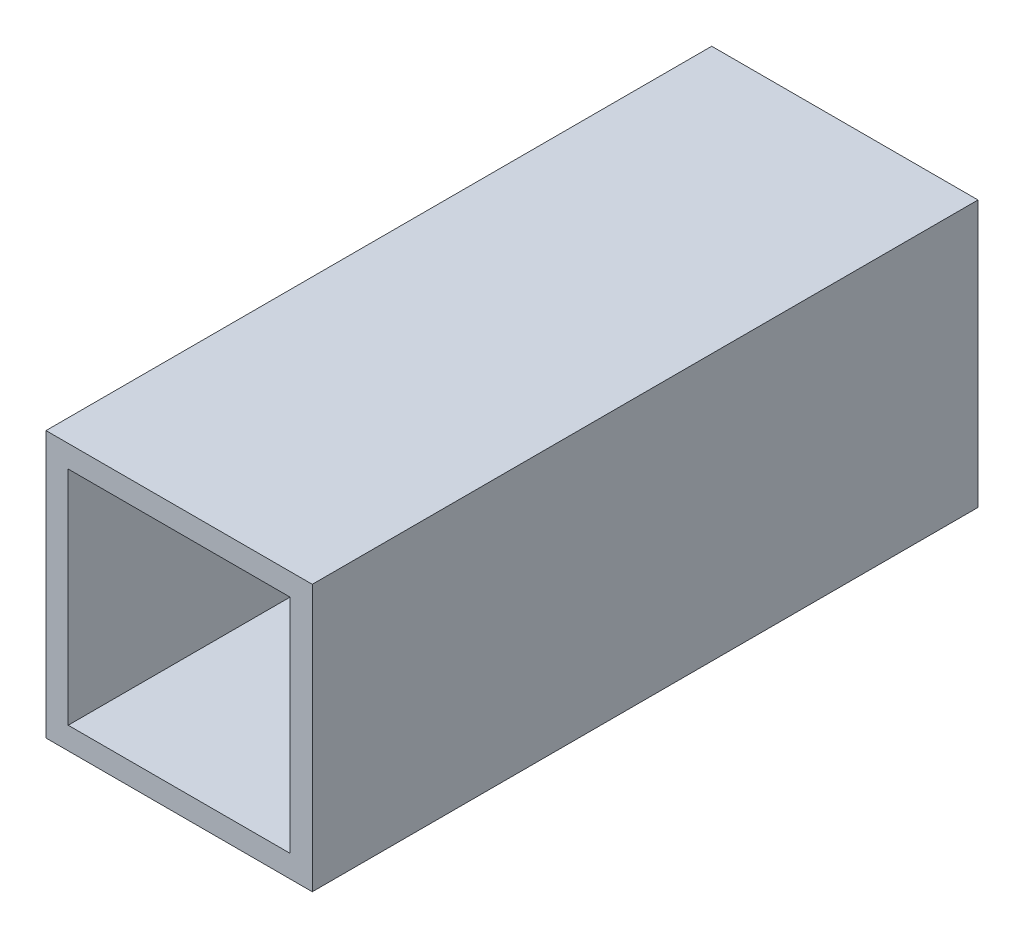
ISO-10303-21;
HEADER;
FILE_DESCRIPTION(('STEP AP214'),'2;1');
FILE_NAME('part.step','',(''),(''),'','','');
FILE_SCHEMA(('AUTOMOTIVE_DESIGN { 1 0 10303 214 1 1 1 1 }'));
ENDSEC;
DATA;
#1=APPLICATION_CONTEXT('core data for automotive mechanical design processes');
#2=APPLICATION_PROTOCOL_DEFINITION('international standard','automotive_design',2000,#1);
#3=PRODUCT_CONTEXT('',#1,'mechanical');
#4=PRODUCT('Part','Part','',(#3));
#5=PRODUCT_RELATED_PRODUCT_CATEGORY('part','',(#4));
#6=PRODUCT_DEFINITION_FORMATION('','',#4);
#7=PRODUCT_DEFINITION_CONTEXT('part definition',#1,'design');
#8=PRODUCT_DEFINITION('design','',#6,#7);
#9=PRODUCT_DEFINITION_SHAPE('','',#8);
#10=(LENGTH_UNIT() NAMED_UNIT(*) SI_UNIT(.MILLI.,.METRE.));
#11=(NAMED_UNIT(*) PLANE_ANGLE_UNIT() SI_UNIT($,.RADIAN.));
#12=(NAMED_UNIT(*) SI_UNIT($,.STERADIAN.) SOLID_ANGLE_UNIT());
#13=UNCERTAINTY_MEASURE_WITH_UNIT(LENGTH_MEASURE(1.E-05),#10,'distance_accuracy_value','');
#14=(GEOMETRIC_REPRESENTATION_CONTEXT(3) GLOBAL_UNCERTAINTY_ASSIGNED_CONTEXT((#13)) GLOBAL_UNIT_ASSIGNED_CONTEXT((#10,
#11,#12)) REPRESENTATION_CONTEXT('',''));
#15=CARTESIAN_POINT('',(0.,0.,0.));
#16=DIRECTION('',(0.,0.,1.));
#17=DIRECTION('',(1.,0.,0.));
#18=AXIS2_PLACEMENT_3D('',#15,#16,#17);
#19=CARTESIAN_POINT('',(0.,0.,60.));
#20=DIRECTION('',(0.,0.,1.));
#21=DIRECTION('',(1.,0.,0.));
#22=AXIS2_PLACEMENT_3D('',#19,#20,#21);
#23=PLANE('',#22);
#24=DIRECTION('',(0.,-1.,0.));
#25=VECTOR('',#24,1.);
#26=CARTESIAN_POINT('',(-12.,12.,60.));
#27=LINE('',#26,#25);
#28=CARTESIAN_POINT('',(-12.,12.,60.));
#29=VERTEX_POINT('',#28);
#30=CARTESIAN_POINT('',(-12.,-12.,60.));
#31=VERTEX_POINT('',#30);
#32=EDGE_CURVE('E136',#29,#31,#27,.T.);
#33=ORIENTED_EDGE('',*,*,#32,.T.);
#34=DIRECTION('',(1.,0.,0.));
#35=VECTOR('',#34,1.);
#36=CARTESIAN_POINT('',(-12.,-12.,60.));
#37=LINE('',#36,#35);
#38=CARTESIAN_POINT('',(12.,-12.,60.));
#39=VERTEX_POINT('',#38);
#40=EDGE_CURVE('E139',#31,#39,#37,.T.);
#41=ORIENTED_EDGE('',*,*,#40,.T.);
#42=DIRECTION('',(0.,1.,0.));
#43=VECTOR('',#42,1.);
#44=CARTESIAN_POINT('',(12.,12.,60.));
#45=LINE('',#44,#43);
#46=CARTESIAN_POINT('',(12.,12.,60.));
#47=VERTEX_POINT('',#46);
#48=EDGE_CURVE('E142',#39,#47,#45,.T.);
#49=ORIENTED_EDGE('',*,*,#48,.T.);
#50=DIRECTION('',(-1.,0.,0.));
#51=VECTOR('',#50,1.);
#52=CARTESIAN_POINT('',(-12.,12.,60.));
#53=LINE('',#52,#51);
#54=EDGE_CURVE('E144',#47,#29,#53,.T.);
#55=ORIENTED_EDGE('',*,*,#54,.T.);
#56=EDGE_LOOP('',(#33,#41,#49,#55));
#57=FACE_BOUND('',#56,.T.);
#58=DIRECTION('',(-1.,0.,0.));
#59=VECTOR('',#58,1.);
#60=CARTESIAN_POINT('',(-10.,10.,60.));
#61=LINE('',#60,#59);
#62=CARTESIAN_POINT('',(10.,10.,60.));
#63=VERTEX_POINT('',#62);
#64=CARTESIAN_POINT('',(-10.,10.,60.));
#65=VERTEX_POINT('',#64);
#66=EDGE_CURVE('E108',#63,#65,#61,.T.);
#67=ORIENTED_EDGE('',*,*,#66,.F.);
#68=DIRECTION('',(0.,1.,0.));
#69=VECTOR('',#68,1.);
#70=CARTESIAN_POINT('',(10.,10.,60.));
#71=LINE('',#70,#69);
#72=CARTESIAN_POINT('',(10.,-10.,60.));
#73=VERTEX_POINT('',#72);
#74=EDGE_CURVE('E100',#73,#63,#71,.T.);
#75=ORIENTED_EDGE('',*,*,#74,.F.);
#76=DIRECTION('',(1.,0.,0.));
#77=VECTOR('',#76,1.);
#78=CARTESIAN_POINT('',(-10.,-10.,60.));
#79=LINE('',#78,#77);
#80=CARTESIAN_POINT('',(-10.,-10.,60.));
#81=VERTEX_POINT('',#80);
#82=EDGE_CURVE('E122',#81,#73,#79,.T.);
#83=ORIENTED_EDGE('',*,*,#82,.F.);
#84=DIRECTION('',(0.,-1.,0.));
#85=VECTOR('',#84,1.);
#86=CARTESIAN_POINT('',(-10.,10.,60.));
#87=LINE('',#86,#85);
#88=EDGE_CURVE('E120',#65,#81,#87,.T.);
#89=ORIENTED_EDGE('',*,*,#88,.F.);
#90=EDGE_LOOP('',(#67,#75,#83,#89));
#91=FACE_BOUND('',#90,.T.);
#92=ADVANCED_FACE('F35',(#57,#91),#23,.T.);
#93=CARTESIAN_POINT('',(0.,0.,0.));
#94=DIRECTION('',(0.,0.,1.));
#95=DIRECTION('',(1.,0.,0.));
#96=AXIS2_PLACEMENT_3D('',#93,#94,#95);
#97=PLANE('',#96);
#98=DIRECTION('',(0.,-1.,0.));
#99=VECTOR('',#98,1.);
#100=CARTESIAN_POINT('',(-12.,12.,0.));
#101=LINE('',#100,#99);
#102=CARTESIAN_POINT('',(-12.,12.,0.));
#103=VERTEX_POINT('',#102);
#104=CARTESIAN_POINT('',(-12.,-12.,0.));
#105=VERTEX_POINT('',#104);
#106=EDGE_CURVE('E116',#103,#105,#101,.T.);
#107=ORIENTED_EDGE('',*,*,#106,.F.);
#108=DIRECTION('',(-1.,0.,0.));
#109=VECTOR('',#108,1.);
#110=CARTESIAN_POINT('',(-12.,12.,0.));
#111=LINE('',#110,#109);
#112=CARTESIAN_POINT('',(12.,12.,0.));
#113=VERTEX_POINT('',#112);
#114=EDGE_CURVE('E140',#113,#103,#111,.T.);
#115=ORIENTED_EDGE('',*,*,#114,.F.);
#116=DIRECTION('',(0.,1.,0.));
#117=VECTOR('',#116,1.);
#118=CARTESIAN_POINT('',(12.,12.,0.));
#119=LINE('',#118,#117);
#120=CARTESIAN_POINT('',(12.,-12.,0.));
#121=VERTEX_POINT('',#120);
#122=EDGE_CURVE('E151',#121,#113,#119,.T.);
#123=ORIENTED_EDGE('',*,*,#122,.F.);
#124=DIRECTION('',(1.,0.,0.));
#125=VECTOR('',#124,1.);
#126=CARTESIAN_POINT('',(-12.,-12.,0.));
#127=LINE('',#126,#125);
#128=EDGE_CURVE('E149',#105,#121,#127,.T.);
#129=ORIENTED_EDGE('',*,*,#128,.F.);
#130=EDGE_LOOP('',(#107,#115,#123,#129));
#131=FACE_BOUND('',#130,.T.);
#132=DIRECTION('',(0.,1.,0.));
#133=VECTOR('',#132,1.);
#134=CARTESIAN_POINT('',(10.,10.,0.));
#135=LINE('',#134,#133);
#136=CARTESIAN_POINT('',(10.,-10.,0.));
#137=VERTEX_POINT('',#136);
#138=CARTESIAN_POINT('',(10.,10.,0.));
#139=VERTEX_POINT('',#138);
#140=EDGE_CURVE('E58',#137,#139,#135,.T.);
#141=ORIENTED_EDGE('',*,*,#140,.T.);
#142=DIRECTION('',(-1.,0.,0.));
#143=VECTOR('',#142,1.);
#144=CARTESIAN_POINT('',(-10.,10.,0.));
#145=LINE('',#144,#143);
#146=CARTESIAN_POINT('',(-10.,10.,0.));
#147=VERTEX_POINT('',#146);
#148=EDGE_CURVE('E115',#139,#147,#145,.T.);
#149=ORIENTED_EDGE('',*,*,#148,.T.);
#150=DIRECTION('',(0.,-1.,0.));
#151=VECTOR('',#150,1.);
#152=CARTESIAN_POINT('',(-10.,10.,0.));
#153=LINE('',#152,#151);
#154=CARTESIAN_POINT('',(-10.,-10.,0.));
#155=VERTEX_POINT('',#154);
#156=EDGE_CURVE('E128',#147,#155,#153,.T.);
#157=ORIENTED_EDGE('',*,*,#156,.T.);
#158=DIRECTION('',(1.,0.,0.));
#159=VECTOR('',#158,1.);
#160=CARTESIAN_POINT('',(-10.,-10.,0.));
#161=LINE('',#160,#159);
#162=EDGE_CURVE('E109',#155,#137,#161,.T.);
#163=ORIENTED_EDGE('',*,*,#162,.T.);
#164=EDGE_LOOP('',(#141,#149,#157,#163));
#165=FACE_BOUND('',#164,.T.);
#166=ADVANCED_FACE('F169',(#131,#165),#97,.F.);
#167=CARTESIAN_POINT('',(-12.,12.,60.));
#168=DIRECTION('',(1.,0.,0.));
#169=DIRECTION('',(0.,1.,0.));
#170=AXIS2_PLACEMENT_3D('',#167,#168,#169);
#171=PLANE('',#170);
#172=ORIENTED_EDGE('',*,*,#106,.T.);
#173=DIRECTION('',(0.,0.,-1.));
#174=VECTOR('',#173,1.);
#175=CARTESIAN_POINT('',(-12.,-12.,60.));
#176=LINE('',#175,#174);
#177=EDGE_CURVE('E11',#31,#105,#176,.T.);
#178=ORIENTED_EDGE('',*,*,#177,.F.);
#179=ORIENTED_EDGE('',*,*,#32,.F.);
#180=DIRECTION('',(0.,0.,-1.));
#181=VECTOR('',#180,1.);
#182=CARTESIAN_POINT('',(-12.,12.,60.));
#183=LINE('',#182,#181);
#184=EDGE_CURVE('E146',#29,#103,#183,.T.);
#185=ORIENTED_EDGE('',*,*,#184,.T.);
#186=EDGE_LOOP('',(#172,#178,#179,#185));
#187=FACE_BOUND('',#186,.T.);
#188=ADVANCED_FACE('F37',(#187),#171,.F.);
#189=CARTESIAN_POINT('',(-12.,-12.,60.));
#190=DIRECTION('',(0.,1.,0.));
#191=DIRECTION('',(-1.,0.,0.));
#192=AXIS2_PLACEMENT_3D('',#189,#190,#191);
#193=PLANE('',#192);
#194=ORIENTED_EDGE('',*,*,#128,.T.);
#195=DIRECTION('',(0.,0.,-1.));
#196=VECTOR('',#195,1.);
#197=CARTESIAN_POINT('',(12.,-12.,60.));
#198=LINE('',#197,#196);
#199=EDGE_CURVE('E43',#39,#121,#198,.T.);
#200=ORIENTED_EDGE('',*,*,#199,.F.);
#201=ORIENTED_EDGE('',*,*,#40,.F.);
#202=ORIENTED_EDGE('',*,*,#177,.T.);
#203=EDGE_LOOP('',(#194,#200,#201,#202));
#204=FACE_BOUND('',#203,.T.);
#205=ADVANCED_FACE('F179',(#204),#193,.F.);
#206=CARTESIAN_POINT('',(12.,12.,60.));
#207=DIRECTION('',(-1.,0.,0.));
#208=DIRECTION('',(0.,-1.,0.));
#209=AXIS2_PLACEMENT_3D('',#206,#207,#208);
#210=PLANE('',#209);
#211=ORIENTED_EDGE('',*,*,#122,.T.);
#212=DIRECTION('',(0.,0.,-1.));
#213=VECTOR('',#212,1.);
#214=CARTESIAN_POINT('',(12.,12.,60.));
#215=LINE('',#214,#213);
#216=EDGE_CURVE('E156',#47,#113,#215,.T.);
#217=ORIENTED_EDGE('',*,*,#216,.F.);
#218=ORIENTED_EDGE('',*,*,#48,.F.);
#219=ORIENTED_EDGE('',*,*,#199,.T.);
#220=EDGE_LOOP('',(#211,#217,#218,#219));
#221=FACE_BOUND('',#220,.T.);
#222=ADVANCED_FACE('F163',(#221),#210,.F.);
#223=CARTESIAN_POINT('',(-12.,12.,60.));
#224=DIRECTION('',(0.,-1.,0.));
#225=DIRECTION('',(0.,0.,-1.));
#226=AXIS2_PLACEMENT_3D('',#223,#224,#225);
#227=PLANE('',#226);
#228=ORIENTED_EDGE('',*,*,#114,.T.);
#229=ORIENTED_EDGE('',*,*,#184,.F.);
#230=ORIENTED_EDGE('',*,*,#54,.F.);
#231=ORIENTED_EDGE('',*,*,#216,.T.);
#232=EDGE_LOOP('',(#228,#229,#230,#231));
#233=FACE_BOUND('',#232,.T.);
#234=ADVANCED_FACE('F173',(#233),#227,.F.);
#235=CARTESIAN_POINT('',(10.,10.,60.));
#236=DIRECTION('',(-1.,0.,0.));
#237=DIRECTION('',(0.,0.,1.));
#238=AXIS2_PLACEMENT_3D('',#235,#236,#237);
#239=PLANE('',#238);
#240=ORIENTED_EDGE('',*,*,#140,.F.);
#241=DIRECTION('',(0.,0.,-1.));
#242=VECTOR('',#241,1.);
#243=CARTESIAN_POINT('',(10.,-10.,60.));
#244=LINE('',#243,#242);
#245=EDGE_CURVE('E104',#73,#137,#244,.T.);
#246=ORIENTED_EDGE('',*,*,#245,.F.);
#247=ORIENTED_EDGE('',*,*,#74,.T.);
#248=DIRECTION('',(0.,0.,-1.));
#249=VECTOR('',#248,1.);
#250=CARTESIAN_POINT('',(10.,10.,60.));
#251=LINE('',#250,#249);
#252=EDGE_CURVE('E103',#63,#139,#251,.T.);
#253=ORIENTED_EDGE('',*,*,#252,.T.);
#254=EDGE_LOOP('',(#240,#246,#247,#253));
#255=FACE_BOUND('',#254,.T.);
#256=ADVANCED_FACE('F102',(#255),#239,.T.);
#257=CARTESIAN_POINT('',(-10.,10.,60.));
#258=DIRECTION('',(0.,-1.,0.));
#259=DIRECTION('',(0.,0.,-1.));
#260=AXIS2_PLACEMENT_3D('',#257,#258,#259);
#261=PLANE('',#260);
#262=ORIENTED_EDGE('',*,*,#148,.F.);
#263=ORIENTED_EDGE('',*,*,#252,.F.);
#264=ORIENTED_EDGE('',*,*,#66,.T.);
#265=DIRECTION('',(0.,0.,-1.));
#266=VECTOR('',#265,1.);
#267=CARTESIAN_POINT('',(-10.,10.,60.));
#268=LINE('',#267,#266);
#269=EDGE_CURVE('E117',#65,#147,#268,.T.);
#270=ORIENTED_EDGE('',*,*,#269,.T.);
#271=EDGE_LOOP('',(#262,#263,#264,#270));
#272=FACE_BOUND('',#271,.T.);
#273=ADVANCED_FACE('F112',(#272),#261,.T.);
#274=CARTESIAN_POINT('',(-10.,10.,60.));
#275=DIRECTION('',(1.,0.,0.));
#276=DIRECTION('',(0.,1.,0.));
#277=AXIS2_PLACEMENT_3D('',#274,#275,#276);
#278=PLANE('',#277);
#279=ORIENTED_EDGE('',*,*,#156,.F.);
#280=ORIENTED_EDGE('',*,*,#269,.F.);
#281=ORIENTED_EDGE('',*,*,#88,.T.);
#282=DIRECTION('',(0.,0.,-1.));
#283=VECTOR('',#282,1.);
#284=CARTESIAN_POINT('',(-10.,-10.,60.));
#285=LINE('',#284,#283);
#286=EDGE_CURVE('E50',#81,#155,#285,.T.);
#287=ORIENTED_EDGE('',*,*,#286,.T.);
#288=EDGE_LOOP('',(#279,#280,#281,#287));
#289=FACE_BOUND('',#288,.T.);
#290=ADVANCED_FACE('F202',(#289),#278,.T.);
#291=CARTESIAN_POINT('',(-10.,-10.,60.));
#292=DIRECTION('',(0.,1.,0.));
#293=DIRECTION('',(0.,0.,1.));
#294=AXIS2_PLACEMENT_3D('',#291,#292,#293);
#295=PLANE('',#294);
#296=ORIENTED_EDGE('',*,*,#162,.F.);
#297=ORIENTED_EDGE('',*,*,#286,.F.);
#298=ORIENTED_EDGE('',*,*,#82,.T.);
#299=ORIENTED_EDGE('',*,*,#245,.T.);
#300=EDGE_LOOP('',(#296,#297,#298,#299));
#301=FACE_BOUND('',#300,.T.);
#302=ADVANCED_FACE('F206',(#301),#295,.T.);
#303=CLOSED_SHELL('',(#92,#166,#188,#205,#222,#234,#256,#273,#290,#302));
#304=MANIFOLD_SOLID_BREP('B2',#303);
#305=ADVANCED_BREP_SHAPE_REPRESENTATION('',(#18,#304),#14);
#306=SHAPE_DEFINITION_REPRESENTATION(#9,#305);
ENDSEC;
END-ISO-10303-21;
